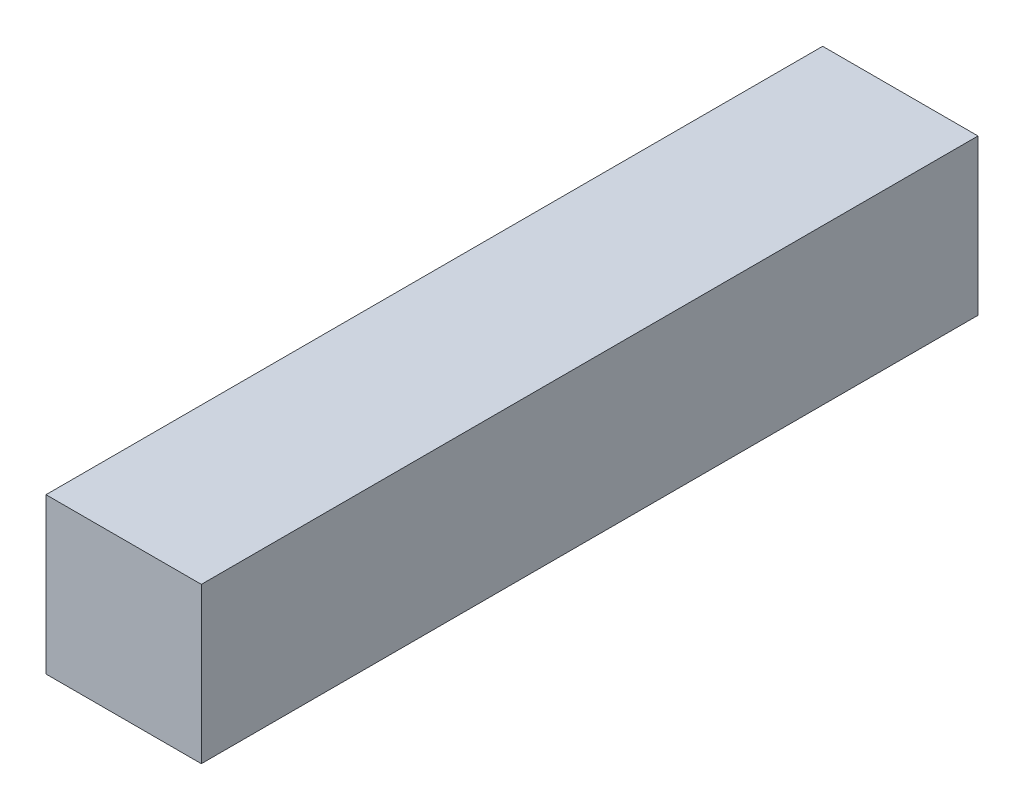
ISO-10303-21;
HEADER;
FILE_DESCRIPTION(('STEP AP214'),'2;1');
FILE_NAME('part.step','',(''),(''),'','','');
FILE_SCHEMA(('AUTOMOTIVE_DESIGN { 1 0 10303 214 1 1 1 1 }'));
ENDSEC;
DATA;
#1=APPLICATION_CONTEXT('core data for automotive mechanical design processes');
#2=APPLICATION_PROTOCOL_DEFINITION('international standard','automotive_design',2000,#1);
#3=PRODUCT_CONTEXT('',#1,'mechanical');
#4=PRODUCT('Part','Part','',(#3));
#5=PRODUCT_RELATED_PRODUCT_CATEGORY('part','',(#4));
#6=PRODUCT_DEFINITION_FORMATION('','',#4);
#7=PRODUCT_DEFINITION_CONTEXT('part definition',#1,'design');
#8=PRODUCT_DEFINITION('design','',#6,#7);
#9=PRODUCT_DEFINITION_SHAPE('','',#8);
#10=(LENGTH_UNIT() NAMED_UNIT(*) SI_UNIT(.MILLI.,.METRE.));
#11=(NAMED_UNIT(*) PLANE_ANGLE_UNIT() SI_UNIT($,.RADIAN.));
#12=(NAMED_UNIT(*) SI_UNIT($,.STERADIAN.) SOLID_ANGLE_UNIT());
#13=UNCERTAINTY_MEASURE_WITH_UNIT(LENGTH_MEASURE(1.E-05),#10,'distance_accuracy_value','');
#14=(GEOMETRIC_REPRESENTATION_CONTEXT(3) GLOBAL_UNCERTAINTY_ASSIGNED_CONTEXT((#13)) GLOBAL_UNIT_ASSIGNED_CONTEXT((#10,
#11,#12)) REPRESENTATION_CONTEXT('',''));
#15=CARTESIAN_POINT('',(0.,0.,0.));
#16=DIRECTION('',(0.,0.,1.));
#17=DIRECTION('',(1.,0.,0.));
#18=AXIS2_PLACEMENT_3D('',#15,#16,#17);
#19=CARTESIAN_POINT('',(2.5,-2.5,25.));
#20=DIRECTION('',(-1.,0.,0.));
#21=DIRECTION('',(0.,0.,1.));
#22=AXIS2_PLACEMENT_3D('',#19,#20,#21);
#23=PLANE('',#22);
#24=DIRECTION('',(0.,1.,0.));
#25=VECTOR('',#24,1.);
#26=CARTESIAN_POINT('',(2.5,-2.5,0.));
#27=LINE('',#26,#25);
#28=CARTESIAN_POINT('',(2.5,-2.5,0.));
#29=VERTEX_POINT('',#28);
#30=CARTESIAN_POINT('',(2.5,2.5,0.));
#31=VERTEX_POINT('',#30);
#32=EDGE_CURVE('E95',#29,#31,#27,.T.);
#33=ORIENTED_EDGE('',*,*,#32,.T.);
#34=DIRECTION('',(0.,0.,-1.));
#35=VECTOR('',#34,1.);
#36=CARTESIAN_POINT('',(2.5,2.5,25.));
#37=LINE('',#36,#35);
#38=CARTESIAN_POINT('',(2.5,2.5,25.));
#39=VERTEX_POINT('',#38);
#40=EDGE_CURVE('E11',#39,#31,#37,.T.);
#41=ORIENTED_EDGE('',*,*,#40,.F.);
#42=DIRECTION('',(0.,1.,0.));
#43=VECTOR('',#42,1.);
#44=CARTESIAN_POINT('',(2.5,-2.5,25.));
#45=LINE('',#44,#43);
#46=CARTESIAN_POINT('',(2.5,-2.5,25.));
#47=VERTEX_POINT('',#46);
#48=EDGE_CURVE('E83',#47,#39,#45,.T.);
#49=ORIENTED_EDGE('',*,*,#48,.F.);
#50=DIRECTION('',(0.,0.,-1.));
#51=VECTOR('',#50,1.);
#52=CARTESIAN_POINT('',(2.5,-2.5,25.));
#53=LINE('',#52,#51);
#54=EDGE_CURVE('E91',#47,#29,#53,.T.);
#55=ORIENTED_EDGE('',*,*,#54,.T.);
#56=EDGE_LOOP('',(#33,#41,#49,#55));
#57=FACE_BOUND('',#56,.T.);
#58=ADVANCED_FACE('F32',(#57),#23,.F.);
#59=CARTESIAN_POINT('',(-2.5,2.5,25.));
#60=DIRECTION('',(0.,-1.,0.));
#61=DIRECTION('',(0.,0.,-1.));
#62=AXIS2_PLACEMENT_3D('',#59,#60,#61);
#63=PLANE('',#62);
#64=DIRECTION('',(-1.,0.,0.));
#65=VECTOR('',#64,1.);
#66=CARTESIAN_POINT('',(-2.5,2.5,0.));
#67=LINE('',#66,#65);
#68=CARTESIAN_POINT('',(-2.5,2.5,0.));
#69=VERTEX_POINT('',#68);
#70=EDGE_CURVE('E87',#31,#69,#67,.T.);
#71=ORIENTED_EDGE('',*,*,#70,.T.);
#72=DIRECTION('',(0.,0.,-1.));
#73=VECTOR('',#72,1.);
#74=CARTESIAN_POINT('',(-2.5,2.5,25.));
#75=LINE('',#74,#73);
#76=CARTESIAN_POINT('',(-2.5,2.5,25.));
#77=VERTEX_POINT('',#76);
#78=EDGE_CURVE('E40',#77,#69,#75,.T.);
#79=ORIENTED_EDGE('',*,*,#78,.F.);
#80=DIRECTION('',(-1.,0.,0.));
#81=VECTOR('',#80,1.);
#82=CARTESIAN_POINT('',(-2.5,2.5,25.));
#83=LINE('',#82,#81);
#84=EDGE_CURVE('E78',#39,#77,#83,.T.);
#85=ORIENTED_EDGE('',*,*,#84,.F.);
#86=ORIENTED_EDGE('',*,*,#40,.T.);
#87=EDGE_LOOP('',(#71,#79,#85,#86));
#88=FACE_BOUND('',#87,.T.);
#89=ADVANCED_FACE('F86',(#88),#63,.F.);
#90=CARTESIAN_POINT('',(-2.5,-2.5,25.));
#91=DIRECTION('',(1.,0.,0.));
#92=DIRECTION('',(0.,0.,-1.));
#93=AXIS2_PLACEMENT_3D('',#90,#91,#92);
#94=PLANE('',#93);
#95=DIRECTION('',(0.,-1.,0.));
#96=VECTOR('',#95,1.);
#97=CARTESIAN_POINT('',(-2.5,-2.5,0.));
#98=LINE('',#97,#96);
#99=CARTESIAN_POINT('',(-2.5,-2.5,0.));
#100=VERTEX_POINT('',#99);
#101=EDGE_CURVE('E65',#69,#100,#98,.T.);
#102=ORIENTED_EDGE('',*,*,#101,.T.);
#103=DIRECTION('',(0.,0.,-1.));
#104=VECTOR('',#103,1.);
#105=CARTESIAN_POINT('',(-2.5,-2.5,25.));
#106=LINE('',#105,#104);
#107=CARTESIAN_POINT('',(-2.5,-2.5,25.));
#108=VERTEX_POINT('',#107);
#109=EDGE_CURVE('E88',#108,#100,#106,.T.);
#110=ORIENTED_EDGE('',*,*,#109,.F.);
#111=DIRECTION('',(0.,-1.,0.));
#112=VECTOR('',#111,1.);
#113=CARTESIAN_POINT('',(-2.5,-2.5,25.));
#114=LINE('',#113,#112);
#115=EDGE_CURVE('E81',#77,#108,#114,.T.);
#116=ORIENTED_EDGE('',*,*,#115,.F.);
#117=ORIENTED_EDGE('',*,*,#78,.T.);
#118=EDGE_LOOP('',(#102,#110,#116,#117));
#119=FACE_BOUND('',#118,.T.);
#120=ADVANCED_FACE('F89',(#119),#94,.F.);
#121=CARTESIAN_POINT('',(-2.5,-2.5,25.));
#122=DIRECTION('',(0.,1.,0.));
#123=DIRECTION('',(0.,0.,1.));
#124=AXIS2_PLACEMENT_3D('',#121,#122,#123);
#125=PLANE('',#124);
#126=DIRECTION('',(1.,0.,0.));
#127=VECTOR('',#126,1.);
#128=CARTESIAN_POINT('',(-2.5,-2.5,0.));
#129=LINE('',#128,#127);
#130=EDGE_CURVE('E71',#100,#29,#129,.T.);
#131=ORIENTED_EDGE('',*,*,#130,.T.);
#132=ORIENTED_EDGE('',*,*,#54,.F.);
#133=DIRECTION('',(1.,0.,0.));
#134=VECTOR('',#133,1.);
#135=CARTESIAN_POINT('',(-2.5,-2.5,25.));
#136=LINE('',#135,#134);
#137=EDGE_CURVE('E48',#108,#47,#136,.T.);
#138=ORIENTED_EDGE('',*,*,#137,.F.);
#139=ORIENTED_EDGE('',*,*,#109,.T.);
#140=EDGE_LOOP('',(#131,#132,#138,#139));
#141=FACE_BOUND('',#140,.T.);
#142=ADVANCED_FACE('F102',(#141),#125,.F.);
#143=CARTESIAN_POINT('',(0.,0.,25.));
#144=DIRECTION('',(0.,0.,-1.));
#145=DIRECTION('',(-1.,0.,0.));
#146=AXIS2_PLACEMENT_3D('',#143,#144,#145);
#147=PLANE('',#146);
#148=ORIENTED_EDGE('',*,*,#48,.T.);
#149=ORIENTED_EDGE('',*,*,#84,.T.);
#150=ORIENTED_EDGE('',*,*,#115,.T.);
#151=ORIENTED_EDGE('',*,*,#137,.T.);
#152=EDGE_LOOP('',(#148,#149,#150,#151));
#153=FACE_BOUND('',#152,.T.);
#154=ADVANCED_FACE('F79',(#153),#147,.F.);
#155=CARTESIAN_POINT('',(0.,0.,0.));
#156=DIRECTION('',(0.,0.,-1.));
#157=DIRECTION('',(-1.,0.,0.));
#158=AXIS2_PLACEMENT_3D('',#155,#156,#157);
#159=PLANE('',#158);
#160=ORIENTED_EDGE('',*,*,#32,.F.);
#161=ORIENTED_EDGE('',*,*,#130,.F.);
#162=ORIENTED_EDGE('',*,*,#101,.F.);
#163=ORIENTED_EDGE('',*,*,#70,.F.);
#164=EDGE_LOOP('',(#160,#161,#162,#163));
#165=FACE_BOUND('',#164,.T.);
#166=ADVANCED_FACE('F105',(#165),#159,.T.);
#167=CLOSED_SHELL('',(#58,#89,#120,#142,#154,#166));
#168=MANIFOLD_SOLID_BREP('B2',#167);
#169=ADVANCED_BREP_SHAPE_REPRESENTATION('',(#18,#168),#14);
#170=SHAPE_DEFINITION_REPRESENTATION(#9,#169);
ENDSEC;
END-ISO-10303-21;
